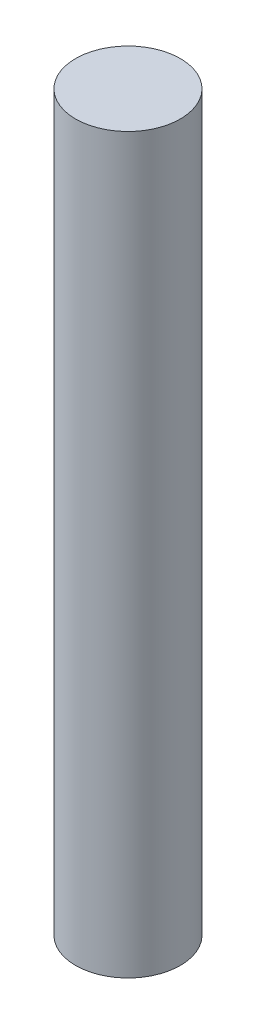
ISO-10303-21;
HEADER;
FILE_DESCRIPTION(('STEP AP214'),'2;1');
FILE_NAME('part.step','',(''),(''),'','','');
FILE_SCHEMA(('AUTOMOTIVE_DESIGN { 1 0 10303 214 1 1 1 1 }'));
ENDSEC;
DATA;
#1=APPLICATION_CONTEXT('core data for automotive mechanical design processes');
#2=APPLICATION_PROTOCOL_DEFINITION('international standard','automotive_design',2000,#1);
#3=PRODUCT_CONTEXT('',#1,'mechanical');
#4=PRODUCT('Part','Part','',(#3));
#5=PRODUCT_RELATED_PRODUCT_CATEGORY('part','',(#4));
#6=PRODUCT_DEFINITION_FORMATION('','',#4);
#7=PRODUCT_DEFINITION_CONTEXT('part definition',#1,'design');
#8=PRODUCT_DEFINITION('design','',#6,#7);
#9=PRODUCT_DEFINITION_SHAPE('','',#8);
#10=(LENGTH_UNIT() NAMED_UNIT(*) SI_UNIT(.MILLI.,.METRE.));
#11=(NAMED_UNIT(*) PLANE_ANGLE_UNIT() SI_UNIT($,.RADIAN.));
#12=(NAMED_UNIT(*) SI_UNIT($,.STERADIAN.) SOLID_ANGLE_UNIT());
#13=UNCERTAINTY_MEASURE_WITH_UNIT(LENGTH_MEASURE(1.E-05),#10,'distance_accuracy_value','');
#14=(GEOMETRIC_REPRESENTATION_CONTEXT(3) GLOBAL_UNCERTAINTY_ASSIGNED_CONTEXT((#13)) GLOBAL_UNIT_ASSIGNED_CONTEXT((#10,
#11,#12)) REPRESENTATION_CONTEXT('',''));
#15=CARTESIAN_POINT('',(0.,0.,0.));
#16=DIRECTION('',(0.,0.,1.));
#17=DIRECTION('',(1.,0.,0.));
#18=AXIS2_PLACEMENT_3D('',#15,#16,#17);
#19=CARTESIAN_POINT('',(0.,11.1125,0.));
#20=DIRECTION('',(0.,-1.,0.));
#21=DIRECTION('',(0.,0.,-1.));
#22=AXIS2_PLACEMENT_3D('',#19,#20,#21);
#23=CYLINDRICAL_SURFACE('',#22,0.79375);
#24=CARTESIAN_POINT('',(0.,11.1125,0.));
#25=DIRECTION('',(0.,1.,0.));
#26=DIRECTION('',(0.,0.,1.));
#27=AXIS2_PLACEMENT_3D('',#24,#25,#26);
#28=CIRCLE('',#27,0.79375);
#29=CARTESIAN_POINT('',(0.,11.1125,0.79375));
#30=VERTEX_POINT('',#29);
#31=EDGE_CURVE('E10',#30,#30,#28,.T.);
#32=ORIENTED_EDGE('',*,*,#31,.F.);
#33=EDGE_LOOP('',(#32));
#34=FACE_BOUND('',#33,.T.);
#35=CARTESIAN_POINT('',(0.,0.,0.));
#36=DIRECTION('',(0.,1.,0.));
#37=DIRECTION('',(0.,0.,1.));
#38=AXIS2_PLACEMENT_3D('',#35,#36,#37);
#39=CIRCLE('',#38,0.79375);
#40=CARTESIAN_POINT('',(0.,0.,0.79375));
#41=VERTEX_POINT('',#40);
#42=EDGE_CURVE('E34',#41,#41,#39,.T.);
#43=ORIENTED_EDGE('',*,*,#42,.T.);
#44=EDGE_LOOP('',(#43));
#45=FACE_BOUND('',#44,.T.);
#46=ADVANCED_FACE('F31',(#34,#45),#23,.T.);
#47=CARTESIAN_POINT('',(0.,11.1125,0.));
#48=DIRECTION('',(0.,1.,0.));
#49=DIRECTION('',(0.,0.,1.));
#50=AXIS2_PLACEMENT_3D('',#47,#48,#49);
#51=PLANE('',#50);
#52=ORIENTED_EDGE('',*,*,#31,.T.);
#53=EDGE_LOOP('',(#52));
#54=FACE_BOUND('',#53,.T.);
#55=ADVANCED_FACE('F46',(#54),#51,.T.);
#56=CARTESIAN_POINT('',(0.,0.,0.));
#57=DIRECTION('',(0.,1.,0.));
#58=DIRECTION('',(0.,0.,1.));
#59=AXIS2_PLACEMENT_3D('',#56,#57,#58);
#60=PLANE('',#59);
#61=ORIENTED_EDGE('',*,*,#42,.F.);
#62=EDGE_LOOP('',(#61));
#63=FACE_BOUND('',#62,.T.);
#64=ADVANCED_FACE('F44',(#63),#60,.F.);
#65=CLOSED_SHELL('',(#46,#55,#64));
#66=MANIFOLD_SOLID_BREP('B2',#65);
#67=ADVANCED_BREP_SHAPE_REPRESENTATION('',(#18,#66),#14);
#68=SHAPE_DEFINITION_REPRESENTATION(#9,#67);
ENDSEC;
END-ISO-10303-21;
